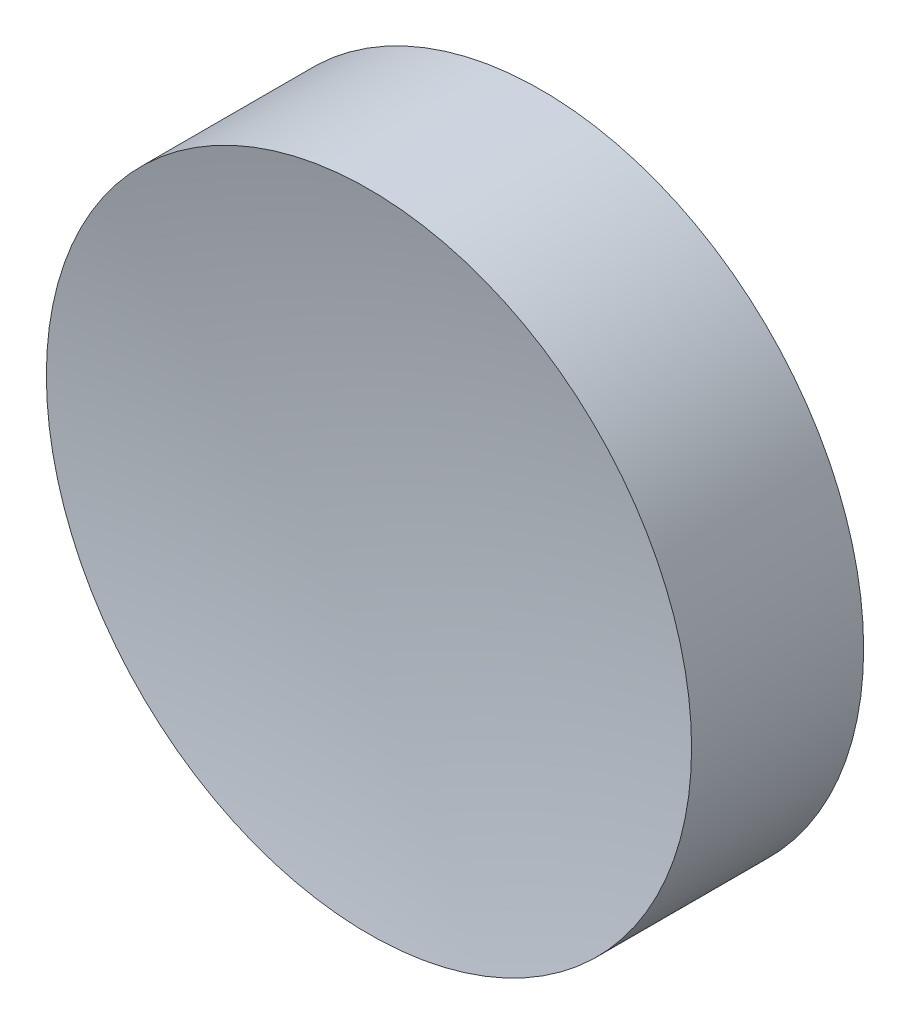
ISO-10303-21;
HEADER;
FILE_DESCRIPTION(('STEP AP214'),'2;1');
FILE_NAME('part.step','',(''),(''),'','','');
FILE_SCHEMA(('AUTOMOTIVE_DESIGN { 1 0 10303 214 1 1 1 1 }'));
ENDSEC;
DATA;
#1=APPLICATION_CONTEXT('core data for automotive mechanical design processes');
#2=APPLICATION_PROTOCOL_DEFINITION('international standard','automotive_design',2000,#1);
#3=PRODUCT_CONTEXT('',#1,'mechanical');
#4=PRODUCT('Part','Part','',(#3));
#5=PRODUCT_RELATED_PRODUCT_CATEGORY('part','',(#4));
#6=PRODUCT_DEFINITION_FORMATION('','',#4);
#7=PRODUCT_DEFINITION_CONTEXT('part definition',#1,'design');
#8=PRODUCT_DEFINITION('design','',#6,#7);
#9=PRODUCT_DEFINITION_SHAPE('','',#8);
#10=(LENGTH_UNIT() NAMED_UNIT(*) SI_UNIT(.MILLI.,.METRE.));
#11=(NAMED_UNIT(*) PLANE_ANGLE_UNIT() SI_UNIT($,.RADIAN.));
#12=(NAMED_UNIT(*) SI_UNIT($,.STERADIAN.) SOLID_ANGLE_UNIT());
#13=UNCERTAINTY_MEASURE_WITH_UNIT(LENGTH_MEASURE(1.E-05),#10,'distance_accuracy_value','');
#14=(GEOMETRIC_REPRESENTATION_CONTEXT(3) GLOBAL_UNCERTAINTY_ASSIGNED_CONTEXT((#13)) GLOBAL_UNIT_ASSIGNED_CONTEXT((#10,
#11,#12)) REPRESENTATION_CONTEXT('',''));
#15=CARTESIAN_POINT('',(0.,0.,0.));
#16=DIRECTION('',(0.,0.,1.));
#17=DIRECTION('',(1.,0.,0.));
#18=AXIS2_PLACEMENT_3D('',#15,#16,#17);
#19=CARTESIAN_POINT('',(0.,0.,16.));
#20=DIRECTION('',(0.,0.,-1.));
#21=DIRECTION('',(-1.,0.,0.));
#22=AXIS2_PLACEMENT_3D('',#19,#20,#21);
#23=CYLINDRICAL_SURFACE('',#22,30.);
#24=CARTESIAN_POINT('',(0.,0.,16.0000000000001));
#25=DIRECTION('',(0.,0.,-1.));
#26=DIRECTION('',(-1.,0.,0.));
#27=AXIS2_PLACEMENT_3D('',#24,#25,#26);
#28=CIRCLE('',#27,30.);
#29=CARTESIAN_POINT('',(-30.,0.,16.0000000000002));
#30=VERTEX_POINT('',#29);
#31=EDGE_CURVE('E44',#30,#30,#28,.T.);
#32=ORIENTED_EDGE('',*,*,#31,.T.);
#33=EDGE_LOOP('',(#32));
#34=FACE_BOUND('',#33,.T.);
#35=CARTESIAN_POINT('',(0.,0.,0.));
#36=DIRECTION('',(0.,0.,1.));
#37=DIRECTION('',(1.,0.,0.));
#38=AXIS2_PLACEMENT_3D('',#35,#36,#37);
#39=CIRCLE('',#38,30.);
#40=CARTESIAN_POINT('',(30.,0.,0.));
#41=VERTEX_POINT('',#40);
#42=EDGE_CURVE('E10',#41,#41,#39,.T.);
#43=ORIENTED_EDGE('',*,*,#42,.T.);
#44=EDGE_LOOP('',(#43));
#45=FACE_BOUND('',#44,.T.);
#46=ADVANCED_FACE('F37',(#34,#45),#23,.T.);
#47=CARTESIAN_POINT('',(0.,0.,0.));
#48=DIRECTION('',(0.,0.,1.));
#49=DIRECTION('',(1.,0.,0.));
#50=AXIS2_PLACEMENT_3D('',#47,#48,#49);
#51=PLANE('',#50);
#52=CARTESIAN_POINT('',(16.,0.,0.));
#53=DIRECTION('',(0.,0.,-1.));
#54=DIRECTION('',(-1.,0.,0.));
#55=AXIS2_PLACEMENT_3D('',#52,#53,#54);
#56=CIRCLE('',#55,2.5);
#57=CARTESIAN_POINT('',(13.5,0.,0.));
#58=VERTEX_POINT('',#57);
#59=EDGE_CURVE('E54',#58,#58,#56,.T.);
#60=ORIENTED_EDGE('',*,*,#59,.F.);
#61=EDGE_LOOP('',(#60));
#62=FACE_BOUND('',#61,.T.);
#63=ORIENTED_EDGE('',*,*,#42,.F.);
#64=EDGE_LOOP('',(#63));
#65=FACE_BOUND('',#64,.T.);
#66=ADVANCED_FACE('F63',(#62,#65),#51,.F.);
#67=CARTESIAN_POINT('',(0.,0.,162.969384566991));
#68=DIRECTION('',(0.,0.,-1.));
#69=DIRECTION('',(1.,0.,0.));
#70=AXIS2_PLACEMENT_3D('',#67,#68,#69);
#71=SPHERICAL_SURFACE('',#70,150.);
#72=ORIENTED_EDGE('',*,*,#31,.F.);
#73=EDGE_LOOP('',(#72));
#74=FACE_BOUND('',#73,.T.);
#75=ADVANCED_FACE('F66',(#74),#71,.F.);
#76=CARTESIAN_POINT('',(16.,0.,6.));
#77=DIRECTION('',(0.,0.,-1.));
#78=DIRECTION('',(-1.,0.,0.));
#79=AXIS2_PLACEMENT_3D('',#76,#77,#78);
#80=CYLINDRICAL_SURFACE('',#79,2.5);
#81=CARTESIAN_POINT('',(16.,0.,6.));
#82=DIRECTION('',(0.,0.,-1.));
#83=DIRECTION('',(-1.,0.,0.));
#84=AXIS2_PLACEMENT_3D('',#81,#82,#83);
#85=CIRCLE('',#84,2.5);
#86=CARTESIAN_POINT('',(13.5,0.,6.));
#87=VERTEX_POINT('',#86);
#88=EDGE_CURVE('E49',#87,#87,#85,.T.);
#89=ORIENTED_EDGE('',*,*,#88,.F.);
#90=EDGE_LOOP('',(#89));
#91=FACE_BOUND('',#90,.T.);
#92=ORIENTED_EDGE('',*,*,#59,.T.);
#93=EDGE_LOOP('',(#92));
#94=FACE_BOUND('',#93,.T.);
#95=ADVANCED_FACE('F61',(#91,#94),#80,.F.);
#96=CARTESIAN_POINT('',(16.,0.,6.));
#97=DIRECTION('',(0.,0.,-1.));
#98=DIRECTION('',(-1.,0.,0.));
#99=AXIS2_PLACEMENT_3D('',#96,#97,#98);
#100=PLANE('',#99);
#101=ORIENTED_EDGE('',*,*,#88,.T.);
#102=EDGE_LOOP('',(#101));
#103=FACE_BOUND('',#102,.T.);
#104=ADVANCED_FACE('F76',(#103),#100,.T.);
#105=CLOSED_SHELL('',(#46,#66,#75,#95,#104));
#106=MANIFOLD_SOLID_BREP('B2',#105);
#107=ADVANCED_BREP_SHAPE_REPRESENTATION('',(#18,#106),#14);
#108=SHAPE_DEFINITION_REPRESENTATION(#9,#107);
ENDSEC;
END-ISO-10303-21;
